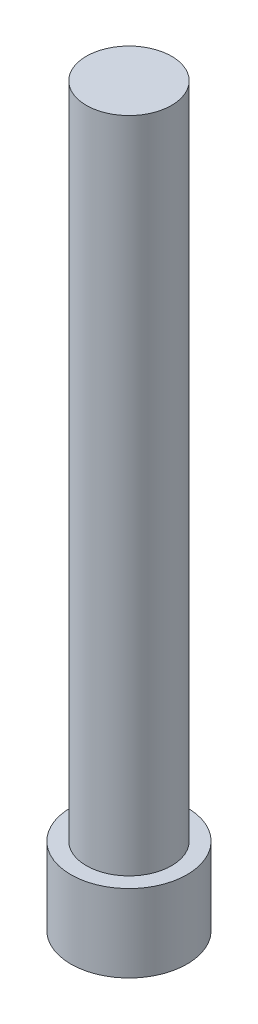
ISO-10303-21;
HEADER;
FILE_DESCRIPTION(('STEP AP214'),'2;1');
FILE_NAME('part.step','',(''),(''),'','','');
FILE_SCHEMA(('AUTOMOTIVE_DESIGN { 1 0 10303 214 1 1 1 1 }'));
ENDSEC;
DATA;
#1=APPLICATION_CONTEXT('core data for automotive mechanical design processes');
#2=APPLICATION_PROTOCOL_DEFINITION('international standard','automotive_design',2000,#1);
#3=PRODUCT_CONTEXT('',#1,'mechanical');
#4=PRODUCT('Part','Part','',(#3));
#5=PRODUCT_RELATED_PRODUCT_CATEGORY('part','',(#4));
#6=PRODUCT_DEFINITION_FORMATION('','',#4);
#7=PRODUCT_DEFINITION_CONTEXT('part definition',#1,'design');
#8=PRODUCT_DEFINITION('design','',#6,#7);
#9=PRODUCT_DEFINITION_SHAPE('','',#8);
#10=(LENGTH_UNIT() NAMED_UNIT(*) SI_UNIT(.MILLI.,.METRE.));
#11=(NAMED_UNIT(*) PLANE_ANGLE_UNIT() SI_UNIT($,.RADIAN.));
#12=(NAMED_UNIT(*) SI_UNIT($,.STERADIAN.) SOLID_ANGLE_UNIT());
#13=UNCERTAINTY_MEASURE_WITH_UNIT(LENGTH_MEASURE(1.E-05),#10,'distance_accuracy_value','');
#14=(GEOMETRIC_REPRESENTATION_CONTEXT(3) GLOBAL_UNCERTAINTY_ASSIGNED_CONTEXT((#13)) GLOBAL_UNIT_ASSIGNED_CONTEXT((#10,
#11,#12)) REPRESENTATION_CONTEXT('',''));
#15=CARTESIAN_POINT('',(0.,0.,0.));
#16=DIRECTION('',(0.,0.,1.));
#17=DIRECTION('',(1.,0.,0.));
#18=AXIS2_PLACEMENT_3D('',#15,#16,#17);
#19=CARTESIAN_POINT('',(0.,9.99999999999994,0.));
#20=DIRECTION('',(0.,-1.,0.));
#21=DIRECTION('',(0.,0.,-1.));
#22=AXIS2_PLACEMENT_3D('',#19,#20,#21);
#23=CYLINDRICAL_SURFACE('',#22,7.5);
#24=CARTESIAN_POINT('',(0.,9.99999999999994,0.));
#25=DIRECTION('',(0.,1.,0.));
#26=DIRECTION('',(0.,0.,1.));
#27=AXIS2_PLACEMENT_3D('',#24,#25,#26);
#28=CIRCLE('',#27,7.5);
#29=CARTESIAN_POINT('',(0.,9.99999999999994,7.5));
#30=VERTEX_POINT('',#29);
#31=EDGE_CURVE('E10',#30,#30,#28,.T.);
#32=ORIENTED_EDGE('',*,*,#31,.F.);
#33=EDGE_LOOP('',(#32));
#34=FACE_BOUND('',#33,.T.);
#35=CARTESIAN_POINT('',(0.,0.,0.));
#36=DIRECTION('',(0.,1.,0.));
#37=DIRECTION('',(0.,0.,1.));
#38=AXIS2_PLACEMENT_3D('',#35,#36,#37);
#39=CIRCLE('',#38,7.5);
#40=CARTESIAN_POINT('',(0.,0.,7.5));
#41=VERTEX_POINT('',#40);
#42=EDGE_CURVE('E34',#41,#41,#39,.T.);
#43=ORIENTED_EDGE('',*,*,#42,.T.);
#44=EDGE_LOOP('',(#43));
#45=FACE_BOUND('',#44,.T.);
#46=ADVANCED_FACE('F31',(#34,#45),#23,.T.);
#47=CARTESIAN_POINT('',(0.,9.99999999999994,0.));
#48=DIRECTION('',(0.,1.,0.));
#49=DIRECTION('',(0.,0.,1.));
#50=AXIS2_PLACEMENT_3D('',#47,#48,#49);
#51=PLANE('',#50);
#52=CARTESIAN_POINT('',(0.,9.99999999999994,0.));
#53=DIRECTION('',(0.,1.,0.));
#54=DIRECTION('',(0.,0.,1.));
#55=AXIS2_PLACEMENT_3D('',#52,#53,#54);
#56=CIRCLE('',#55,5.5);
#57=CARTESIAN_POINT('',(0.,9.99999999999994,5.5));
#58=VERTEX_POINT('',#57);
#59=EDGE_CURVE('E43',#58,#58,#56,.T.);
#60=ORIENTED_EDGE('',*,*,#59,.F.);
#61=EDGE_LOOP('',(#60));
#62=FACE_BOUND('',#61,.T.);
#63=ORIENTED_EDGE('',*,*,#31,.T.);
#64=EDGE_LOOP('',(#63));
#65=FACE_BOUND('',#64,.T.);
#66=ADVANCED_FACE('F58',(#62,#65),#51,.T.);
#67=CARTESIAN_POINT('',(0.,0.,0.));
#68=DIRECTION('',(0.,1.,0.));
#69=DIRECTION('',(0.,0.,1.));
#70=AXIS2_PLACEMENT_3D('',#67,#68,#69);
#71=PLANE('',#70);
#72=ORIENTED_EDGE('',*,*,#42,.F.);
#73=EDGE_LOOP('',(#72));
#74=FACE_BOUND('',#73,.T.);
#75=ADVANCED_FACE('F54',(#74),#71,.F.);
#76=CARTESIAN_POINT('',(0.,94.9999999999999,0.));
#77=DIRECTION('',(0.,-1.,0.));
#78=DIRECTION('',(0.,0.,-1.));
#79=AXIS2_PLACEMENT_3D('',#76,#77,#78);
#80=CYLINDRICAL_SURFACE('',#79,5.5);
#81=CARTESIAN_POINT('',(0.,94.9999999999999,0.));
#82=DIRECTION('',(0.,1.,0.));
#83=DIRECTION('',(0.,0.,1.));
#84=AXIS2_PLACEMENT_3D('',#81,#82,#83);
#85=CIRCLE('',#84,5.5);
#86=CARTESIAN_POINT('',(0.,94.9999999999999,5.5));
#87=VERTEX_POINT('',#86);
#88=EDGE_CURVE('E41',#87,#87,#85,.T.);
#89=ORIENTED_EDGE('',*,*,#88,.F.);
#90=EDGE_LOOP('',(#89));
#91=FACE_BOUND('',#90,.T.);
#92=ORIENTED_EDGE('',*,*,#59,.T.);
#93=EDGE_LOOP('',(#92));
#94=FACE_BOUND('',#93,.T.);
#95=ADVANCED_FACE('F51',(#91,#94),#80,.T.);
#96=CARTESIAN_POINT('',(0.,94.9999999999999,0.));
#97=DIRECTION('',(0.,1.,0.));
#98=DIRECTION('',(0.,0.,1.));
#99=AXIS2_PLACEMENT_3D('',#96,#97,#98);
#100=PLANE('',#99);
#101=ORIENTED_EDGE('',*,*,#88,.T.);
#102=EDGE_LOOP('',(#101));
#103=FACE_BOUND('',#102,.T.);
#104=ADVANCED_FACE('F49',(#103),#100,.T.);
#105=CLOSED_SHELL('',(#46,#66,#75,#95,#104));
#106=MANIFOLD_SOLID_BREP('B2',#105);
#107=ADVANCED_BREP_SHAPE_REPRESENTATION('',(#18,#106),#14);
#108=SHAPE_DEFINITION_REPRESENTATION(#9,#107);
ENDSEC;
END-ISO-10303-21;
